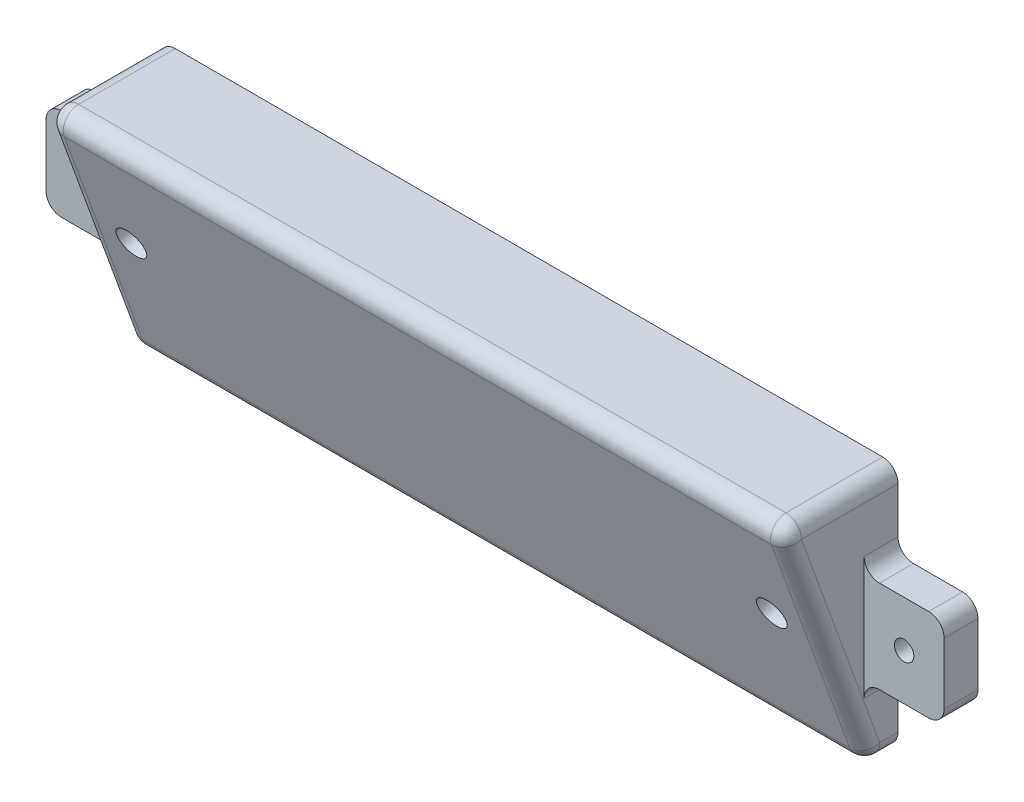
ISO-10303-21;
HEADER;
FILE_DESCRIPTION(('STEP AP214'),'2;1');
FILE_NAME('part.step','',(''),(''),'','','');
FILE_SCHEMA(('AUTOMOTIVE_DESIGN { 1 0 10303 214 1 1 1 1 }'));
ENDSEC;
DATA;
#1=APPLICATION_CONTEXT('core data for automotive mechanical design processes');
#2=APPLICATION_PROTOCOL_DEFINITION('international standard','automotive_design',2000,#1);
#3=PRODUCT_CONTEXT('',#1,'mechanical');
#4=PRODUCT('Part','Part','',(#3));
#5=PRODUCT_RELATED_PRODUCT_CATEGORY('part','',(#4));
#6=PRODUCT_DEFINITION_FORMATION('','',#4);
#7=PRODUCT_DEFINITION_CONTEXT('part definition',#1,'design');
#8=PRODUCT_DEFINITION('design','',#6,#7);
#9=PRODUCT_DEFINITION_SHAPE('','',#8);
#10=(LENGTH_UNIT() NAMED_UNIT(*) SI_UNIT(.MILLI.,.METRE.));
#11=(NAMED_UNIT(*) PLANE_ANGLE_UNIT() SI_UNIT($,.RADIAN.));
#12=(NAMED_UNIT(*) SI_UNIT($,.STERADIAN.) SOLID_ANGLE_UNIT());
#13=UNCERTAINTY_MEASURE_WITH_UNIT(LENGTH_MEASURE(1.E-05),#10,'distance_accuracy_value','');
#14=(GEOMETRIC_REPRESENTATION_CONTEXT(3) GLOBAL_UNCERTAINTY_ASSIGNED_CONTEXT((#13)) GLOBAL_UNIT_ASSIGNED_CONTEXT((#10,
#11,#12)) REPRESENTATION_CONTEXT('',''));
#15=CARTESIAN_POINT('',(0.,0.,0.));
#16=DIRECTION('',(0.,0.,1.));
#17=DIRECTION('',(1.,0.,0.));
#18=AXIS2_PLACEMENT_3D('',#15,#16,#17);
#19=CARTESIAN_POINT('',(-76.2,0.,6.));
#20=DIRECTION('',(1.,0.,0.));
#21=DIRECTION('',(0.,0.,-1.));
#22=AXIS2_PLACEMENT_3D('',#19,#20,#21);
#23=PLANE('',#22);
#24=DIRECTION('',(0.,-1.,0.));
#25=VECTOR('',#24,1.);
#26=CARTESIAN_POINT('',(-76.2,0.,0.));
#27=LINE('',#26,#25);
#28=CARTESIAN_POINT('',(-76.2,-12.7,0.));
#29=VERTEX_POINT('',#28);
#30=CARTESIAN_POINT('',(-76.2,-22.225,0.));
#31=VERTEX_POINT('',#30);
#32=EDGE_CURVE('E487',#29,#31,#27,.T.);
#33=ORIENTED_EDGE('',*,*,#32,.T.);
#34=DIRECTION('',(0.,0.,-1.));
#35=VECTOR('',#34,1.);
#36=CARTESIAN_POINT('',(-76.2,-22.225,6.));
#37=LINE('',#36,#35);
#38=CARTESIAN_POINT('',(-76.2,-22.225,3.77684106618417));
#39=VERTEX_POINT('',#38);
#40=EDGE_CURVE('E346',#31,#39,#37,.F.);
#41=ORIENTED_EDGE('',*,*,#40,.T.);
#42=DIRECTION('',(0.,0.939692620785908,0.342020143325669));
#43=VECTOR('',#42,1.);
#44=CARTESIAN_POINT('',(-76.2,26.485913955059,21.5061638297279));
#45=LINE('',#44,#43);
#46=CARTESIAN_POINT('',(-76.2,22.225,19.9553179793169));
#47=VERTEX_POINT('',#46);
#48=EDGE_CURVE('E240',#39,#47,#45,.T.);
#49=ORIENTED_EDGE('',*,*,#48,.T.);
#50=DIRECTION('',(0.,0.,-1.));
#51=VECTOR('',#50,1.);
#52=CARTESIAN_POINT('',(-76.2,22.225,0.));
#53=LINE('',#52,#51);
#54=CARTESIAN_POINT('',(-76.2,22.225,0.));
#55=VERTEX_POINT('',#54);
#56=EDGE_CURVE('E341',#47,#55,#53,.T.);
#57=ORIENTED_EDGE('',*,*,#56,.T.);
#58=CARTESIAN_POINT('',(-76.2,12.7,0.));
#59=VERTEX_POINT('',#58);
#60=EDGE_CURVE('E264',#55,#59,#27,.T.);
#61=ORIENTED_EDGE('',*,*,#60,.T.);
#62=DIRECTION('',(0.,0.,-1.));
#63=VECTOR('',#62,1.);
#64=CARTESIAN_POINT('',(-76.2,12.7,6.));
#65=LINE('',#64,#63);
#66=CARTESIAN_POINT('',(-76.2,12.7,7.));
#67=VERTEX_POINT('',#66);
#68=EDGE_CURVE('E333',#59,#67,#65,.F.);
#69=ORIENTED_EDGE('',*,*,#68,.T.);
#70=DIRECTION('',(0.,1.,0.));
#71=VECTOR('',#70,1.);
#72=CARTESIAN_POINT('',(-76.2,0.,7.));
#73=LINE('',#72,#71);
#74=CARTESIAN_POINT('',(-76.2,-12.7,7.));
#75=VERTEX_POINT('',#74);
#76=EDGE_CURVE('E690',#75,#67,#73,.T.);
#77=ORIENTED_EDGE('',*,*,#76,.F.);
#78=DIRECTION('',(0.,0.,-1.));
#79=VECTOR('',#78,1.);
#80=CARTESIAN_POINT('',(-76.2,-12.7,6.));
#81=LINE('',#80,#79);
#82=EDGE_CURVE('E337',#75,#29,#81,.T.);
#83=ORIENTED_EDGE('',*,*,#82,.T.);
#84=EDGE_LOOP('',(#33,#41,#49,#57,#61,#69,#77,#83));
#85=FACE_BOUND('',#84,.T.);
#86=ADVANCED_FACE('F45',(#85),#23,.F.);
#87=CARTESIAN_POINT('',(76.2,0.,6.));
#88=DIRECTION('',(1.,0.,0.));
#89=DIRECTION('',(0.,0.,-1.));
#90=AXIS2_PLACEMENT_3D('',#87,#88,#89);
#91=PLANE('',#90);
#92=DIRECTION('',(0.,0.939692620785908,0.342020143325669));
#93=VECTOR('',#92,1.);
#94=CARTESIAN_POINT('',(76.2,-1.88532161732999,11.1798785720238));
#95=LINE('',#94,#93);
#96=CARTESIAN_POINT('',(76.2,22.225,19.9553179793169));
#97=VERTEX_POINT('',#96);
#98=CARTESIAN_POINT('',(76.2,-22.225,3.77684106618417));
#99=VERTEX_POINT('',#98);
#100=EDGE_CURVE('E284',#97,#99,#95,.F.);
#101=ORIENTED_EDGE('',*,*,#100,.T.);
#102=DIRECTION('',(0.,0.,-1.));
#103=VECTOR('',#102,1.);
#104=CARTESIAN_POINT('',(76.2,-22.225,0.));
#105=LINE('',#104,#103);
#106=CARTESIAN_POINT('',(76.2,-22.225,0.));
#107=VERTEX_POINT('',#106);
#108=EDGE_CURVE('E288',#99,#107,#105,.T.);
#109=ORIENTED_EDGE('',*,*,#108,.T.);
#110=DIRECTION('',(0.,-1.,0.));
#111=VECTOR('',#110,1.);
#112=CARTESIAN_POINT('',(76.2,0.,0.));
#113=LINE('',#112,#111);
#114=CARTESIAN_POINT('',(76.2,-12.7,0.));
#115=VERTEX_POINT('',#114);
#116=EDGE_CURVE('E483',#115,#107,#113,.T.);
#117=ORIENTED_EDGE('',*,*,#116,.F.);
#118=DIRECTION('',(0.,0.,-1.));
#119=VECTOR('',#118,1.);
#120=CARTESIAN_POINT('',(76.2,-12.7,6.));
#121=LINE('',#120,#119);
#122=CARTESIAN_POINT('',(76.2,-12.7,7.));
#123=VERTEX_POINT('',#122);
#124=EDGE_CURVE('E273',#115,#123,#121,.F.);
#125=ORIENTED_EDGE('',*,*,#124,.T.);
#126=DIRECTION('',(0.,-1.,0.));
#127=VECTOR('',#126,1.);
#128=CARTESIAN_POINT('',(76.2,0.,7.));
#129=LINE('',#128,#127);
#130=CARTESIAN_POINT('',(76.2,12.7,7.));
#131=VERTEX_POINT('',#130);
#132=EDGE_CURVE('E539',#131,#123,#129,.T.);
#133=ORIENTED_EDGE('',*,*,#132,.F.);
#134=DIRECTION('',(0.,0.,-1.));
#135=VECTOR('',#134,1.);
#136=CARTESIAN_POINT('',(76.2,12.7,0.));
#137=LINE('',#136,#135);
#138=CARTESIAN_POINT('',(76.2,12.7,0.));
#139=VERTEX_POINT('',#138);
#140=EDGE_CURVE('E277',#131,#139,#137,.T.);
#141=ORIENTED_EDGE('',*,*,#140,.T.);
#142=CARTESIAN_POINT('',(76.2,22.225,0.));
#143=VERTEX_POINT('',#142);
#144=EDGE_CURVE('E477',#143,#139,#113,.T.);
#145=ORIENTED_EDGE('',*,*,#144,.F.);
#146=DIRECTION('',(0.,0.,-1.));
#147=VECTOR('',#146,1.);
#148=CARTESIAN_POINT('',(76.2,22.225,6.));
#149=LINE('',#148,#147);
#150=EDGE_CURVE('E281',#143,#97,#149,.F.);
#151=ORIENTED_EDGE('',*,*,#150,.T.);
#152=EDGE_LOOP('',(#101,#109,#117,#125,#133,#141,#145,#151));
#153=FACE_BOUND('',#152,.T.);
#154=ADVANCED_FACE('F480',(#153),#91,.T.);
#155=CARTESIAN_POINT('',(0.,25.4,6.));
#156=DIRECTION('',(0.,1.,0.));
#157=DIRECTION('',(0.,0.,1.));
#158=AXIS2_PLACEMENT_3D('',#155,#156,#157);
#159=PLANE('',#158);
#160=DIRECTION('',(-1.,0.,0.));
#161=VECTOR('',#160,1.);
#162=CARTESIAN_POINT('',(0.,25.4,19.9553179793169));
#163=LINE('',#162,#161);
#164=CARTESIAN_POINT('',(-73.025,25.4,19.9553179793169));
#165=VERTEX_POINT('',#164);
#166=CARTESIAN_POINT('',(73.025,25.4,19.9553179793169));
#167=VERTEX_POINT('',#166);
#168=EDGE_CURVE('E327',#165,#167,#163,.F.);
#169=ORIENTED_EDGE('',*,*,#168,.T.);
#170=DIRECTION('',(0.,0.,-1.));
#171=VECTOR('',#170,1.);
#172=CARTESIAN_POINT('',(73.025,25.4,6.));
#173=LINE('',#172,#171);
#174=CARTESIAN_POINT('',(73.025,25.4,0.));
#175=VERTEX_POINT('',#174);
#176=EDGE_CURVE('E330',#167,#175,#173,.T.);
#177=ORIENTED_EDGE('',*,*,#176,.T.);
#178=DIRECTION('',(1.,0.,0.));
#179=VECTOR('',#178,1.);
#180=CARTESIAN_POINT('',(0.,25.4,0.));
#181=LINE('',#180,#179);
#182=CARTESIAN_POINT('',(-73.025,25.4,0.));
#183=VERTEX_POINT('',#182);
#184=EDGE_CURVE('E478',#183,#175,#181,.T.);
#185=ORIENTED_EDGE('',*,*,#184,.F.);
#186=DIRECTION('',(0.,0.,-1.));
#187=VECTOR('',#186,1.);
#188=CARTESIAN_POINT('',(-73.025,25.4,24.4896879007231));
#189=LINE('',#188,#187);
#190=EDGE_CURVE('E324',#183,#165,#189,.F.);
#191=ORIENTED_EDGE('',*,*,#190,.T.);
#192=EDGE_LOOP('',(#169,#177,#185,#191));
#193=FACE_BOUND('',#192,.T.);
#194=ADVANCED_FACE('F461',(#193),#159,.T.);
#195=CARTESIAN_POINT('',(0.,-25.4,6.));
#196=DIRECTION('',(0.,1.,0.));
#197=DIRECTION('',(0.,0.,1.));
#198=AXIS2_PLACEMENT_3D('',#195,#196,#197);
#199=PLANE('',#198);
#200=DIRECTION('',(1.,0.,0.));
#201=VECTOR('',#200,1.);
#202=CARTESIAN_POINT('',(0.,-25.4,0.));
#203=LINE('',#202,#201);
#204=CARTESIAN_POINT('',(-73.025,-25.4,0.));
#205=VERTEX_POINT('',#204);
#206=CARTESIAN_POINT('',(73.025,-25.4,0.));
#207=VERTEX_POINT('',#206);
#208=EDGE_CURVE('E260',#205,#207,#203,.T.);
#209=ORIENTED_EDGE('',*,*,#208,.T.);
#210=DIRECTION('',(0.,0.,-1.));
#211=VECTOR('',#210,1.);
#212=CARTESIAN_POINT('',(73.025,-25.4,6.));
#213=LINE('',#212,#211);
#214=CARTESIAN_POINT('',(73.025,-25.4,3.77684106618417));
#215=VERTEX_POINT('',#214);
#216=EDGE_CURVE('E321',#207,#215,#213,.F.);
#217=ORIENTED_EDGE('',*,*,#216,.T.);
#218=DIRECTION('',(1.,0.,0.));
#219=VECTOR('',#218,1.);
#220=CARTESIAN_POINT('',(-76.2,-25.4,3.77684106618417));
#221=LINE('',#220,#219);
#222=CARTESIAN_POINT('',(-73.025,-25.4,3.77684106618417));
#223=VERTEX_POINT('',#222);
#224=EDGE_CURVE('E318',#215,#223,#221,.F.);
#225=ORIENTED_EDGE('',*,*,#224,.T.);
#226=DIRECTION('',(0.,0.,-1.));
#227=VECTOR('',#226,1.);
#228=CARTESIAN_POINT('',(-73.025,-25.4,6.));
#229=LINE('',#228,#227);
#230=EDGE_CURVE('E315',#223,#205,#229,.T.);
#231=ORIENTED_EDGE('',*,*,#230,.T.);
#232=EDGE_LOOP('',(#209,#217,#225,#231));
#233=FACE_BOUND('',#232,.T.);
#234=ADVANCED_FACE('F600',(#233),#199,.F.);
#235=CARTESIAN_POINT('',(0.,0.,0.));
#236=DIRECTION('',(0.,0.,1.));
#237=DIRECTION('',(1.,0.,0.));
#238=AXIS2_PLACEMENT_3D('',#235,#236,#237);
#239=PLANE('',#238);
#240=ORIENTED_EDGE('',*,*,#116,.T.);
#241=CARTESIAN_POINT('',(73.025,-22.225,0.));
#242=DIRECTION('',(0.,0.,1.));
#243=DIRECTION('',(1.,0.,0.));
#244=AXIS2_PLACEMENT_3D('',#241,#242,#243);
#245=CIRCLE('',#244,3.175);
#246=EDGE_CURVE('E312',#107,#207,#245,.F.);
#247=ORIENTED_EDGE('',*,*,#246,.T.);
#248=ORIENTED_EDGE('',*,*,#208,.F.);
#249=CARTESIAN_POINT('',(-73.025,-22.225,0.));
#250=DIRECTION('',(0.,0.,1.));
#251=DIRECTION('',(1.,0.,0.));
#252=AXIS2_PLACEMENT_3D('',#249,#250,#251);
#253=CIRCLE('',#252,3.175);
#254=EDGE_CURVE('E306',#205,#31,#253,.F.);
#255=ORIENTED_EDGE('',*,*,#254,.T.);
#256=ORIENTED_EDGE('',*,*,#32,.F.);
#257=CARTESIAN_POINT('',(-79.375,-12.7,0.));
#258=DIRECTION('',(0.,0.,1.));
#259=DIRECTION('',(1.,0.,0.));
#260=AXIS2_PLACEMENT_3D('',#257,#258,#259);
#261=CIRCLE('',#260,3.175);
#262=CARTESIAN_POINT('',(-79.375,-9.525,0.));
#263=VERTEX_POINT('',#262);
#264=EDGE_CURVE('E414',#29,#263,#261,.T.);
#265=ORIENTED_EDGE('',*,*,#264,.T.);
#266=DIRECTION('',(-1.,0.,0.));
#267=VECTOR('',#266,1.);
#268=CARTESIAN_POINT('',(0.,-9.52500000000003,0.));
#269=LINE('',#268,#267);
#270=CARTESIAN_POINT('',(-89.535,-9.525,0.));
#271=VERTEX_POINT('',#270);
#272=EDGE_CURVE('E511',#263,#271,#269,.T.);
#273=ORIENTED_EDGE('',*,*,#272,.T.);
#274=CARTESIAN_POINT('',(-89.535,-6.35,0.));
#275=DIRECTION('',(0.,0.,1.));
#276=DIRECTION('',(1.,0.,0.));
#277=AXIS2_PLACEMENT_3D('',#274,#275,#276);
#278=CIRCLE('',#277,3.175);
#279=CARTESIAN_POINT('',(-92.71,-6.35,0.));
#280=VERTEX_POINT('',#279);
#281=EDGE_CURVE('E291',#271,#280,#278,.F.);
#282=ORIENTED_EDGE('',*,*,#281,.T.);
#283=DIRECTION('',(0.,1.,0.));
#284=VECTOR('',#283,1.);
#285=CARTESIAN_POINT('',(-92.71,0.,0.));
#286=LINE('',#285,#284);
#287=CARTESIAN_POINT('',(-92.71,6.35,0.));
#288=VERTEX_POINT('',#287);
#289=EDGE_CURVE('E517',#280,#288,#286,.T.);
#290=ORIENTED_EDGE('',*,*,#289,.T.);
#291=CARTESIAN_POINT('',(-89.535,6.35,0.));
#292=DIRECTION('',(0.,0.,1.));
#293=DIRECTION('',(1.,0.,0.));
#294=AXIS2_PLACEMENT_3D('',#291,#292,#293);
#295=CIRCLE('',#294,3.175);
#296=CARTESIAN_POINT('',(-89.535,9.525,0.));
#297=VERTEX_POINT('',#296);
#298=EDGE_CURVE('E294',#288,#297,#295,.F.);
#299=ORIENTED_EDGE('',*,*,#298,.T.);
#300=DIRECTION('',(1.,0.,0.));
#301=VECTOR('',#300,1.);
#302=CARTESIAN_POINT('',(0.,9.52500000000001,0.));
#303=LINE('',#302,#301);
#304=CARTESIAN_POINT('',(-79.375,9.525,0.));
#305=VERTEX_POINT('',#304);
#306=EDGE_CURVE('E526',#297,#305,#303,.T.);
#307=ORIENTED_EDGE('',*,*,#306,.T.);
#308=CARTESIAN_POINT('',(-79.375,12.7,0.));
#309=DIRECTION('',(0.,0.,1.));
#310=DIRECTION('',(1.,0.,0.));
#311=AXIS2_PLACEMENT_3D('',#308,#309,#310);
#312=CIRCLE('',#311,3.175);
#313=EDGE_CURVE('E55',#305,#59,#312,.T.);
#314=ORIENTED_EDGE('',*,*,#313,.T.);
#315=ORIENTED_EDGE('',*,*,#60,.F.);
#316=CARTESIAN_POINT('',(-73.025,22.225,0.));
#317=DIRECTION('',(0.,0.,1.));
#318=DIRECTION('',(1.,0.,0.));
#319=AXIS2_PLACEMENT_3D('',#316,#317,#318);
#320=CIRCLE('',#319,3.175);
#321=EDGE_CURVE('E303',#55,#183,#320,.F.);
#322=ORIENTED_EDGE('',*,*,#321,.T.);
#323=ORIENTED_EDGE('',*,*,#184,.T.);
#324=CARTESIAN_POINT('',(73.025,22.225,0.));
#325=DIRECTION('',(0.,0.,1.));
#326=DIRECTION('',(1.,0.,0.));
#327=AXIS2_PLACEMENT_3D('',#324,#325,#326);
#328=CIRCLE('',#327,3.175);
#329=EDGE_CURVE('E309',#175,#143,#328,.F.);
#330=ORIENTED_EDGE('',*,*,#329,.T.);
#331=ORIENTED_EDGE('',*,*,#144,.T.);
#332=CARTESIAN_POINT('',(79.375,12.7,0.));
#333=DIRECTION('',(0.,0.,1.));
#334=DIRECTION('',(1.,0.,0.));
#335=AXIS2_PLACEMENT_3D('',#332,#333,#334);
#336=CIRCLE('',#335,3.175);
#337=CARTESIAN_POINT('',(79.375,9.525,0.));
#338=VERTEX_POINT('',#337);
#339=EDGE_CURVE('E401',#139,#338,#336,.T.);
#340=ORIENTED_EDGE('',*,*,#339,.T.);
#341=DIRECTION('',(1.,0.,0.));
#342=VECTOR('',#341,1.);
#343=CARTESIAN_POINT('',(0.,9.52500000000003,0.));
#344=LINE('',#343,#342);
#345=CARTESIAN_POINT('',(89.535,9.525,0.));
#346=VERTEX_POINT('',#345);
#347=EDGE_CURVE('E556',#338,#346,#344,.T.);
#348=ORIENTED_EDGE('',*,*,#347,.T.);
#349=CARTESIAN_POINT('',(89.535,6.35,0.));
#350=DIRECTION('',(0.,0.,1.));
#351=DIRECTION('',(1.,0.,0.));
#352=AXIS2_PLACEMENT_3D('',#349,#350,#351);
#353=CIRCLE('',#352,3.175);
#354=CARTESIAN_POINT('',(92.71,6.35,0.));
#355=VERTEX_POINT('',#354);
#356=EDGE_CURVE('E300',#346,#355,#353,.F.);
#357=ORIENTED_EDGE('',*,*,#356,.T.);
#358=DIRECTION('',(0.,-1.,0.));
#359=VECTOR('',#358,1.);
#360=CARTESIAN_POINT('',(92.71,0.,0.));
#361=LINE('',#360,#359);
#362=CARTESIAN_POINT('',(92.71,-6.35,0.));
#363=VERTEX_POINT('',#362);
#364=EDGE_CURVE('E491',#355,#363,#361,.T.);
#365=ORIENTED_EDGE('',*,*,#364,.T.);
#366=CARTESIAN_POINT('',(89.535,-6.35,0.));
#367=DIRECTION('',(0.,0.,1.));
#368=DIRECTION('',(1.,0.,0.));
#369=AXIS2_PLACEMENT_3D('',#366,#367,#368);
#370=CIRCLE('',#369,3.175);
#371=CARTESIAN_POINT('',(89.535,-9.525,0.));
#372=VERTEX_POINT('',#371);
#373=EDGE_CURVE('E297',#363,#372,#370,.F.);
#374=ORIENTED_EDGE('',*,*,#373,.T.);
#375=DIRECTION('',(1.,0.,0.));
#376=VECTOR('',#375,1.);
#377=CARTESIAN_POINT('',(0.,-9.52500000000003,0.));
#378=LINE('',#377,#376);
#379=CARTESIAN_POINT('',(79.375,-9.525,0.));
#380=VERTEX_POINT('',#379);
#381=EDGE_CURVE('E553',#380,#372,#378,.T.);
#382=ORIENTED_EDGE('',*,*,#381,.F.);
#383=CARTESIAN_POINT('',(79.375,-12.7,0.));
#384=DIRECTION('',(0.,0.,1.));
#385=DIRECTION('',(1.,0.,0.));
#386=AXIS2_PLACEMENT_3D('',#383,#384,#385);
#387=CIRCLE('',#386,3.175);
#388=EDGE_CURVE('E408',#380,#115,#387,.T.);
#389=ORIENTED_EDGE('',*,*,#388,.T.);
#390=EDGE_LOOP('',(#240,#247,#248,#255,#256,#265,#273,#282,#290,#299,#307,#314,#315,#322,#323,
#330,#331,#340,#348,#357,#365,#374,#382,#389));
#391=FACE_BOUND('',#390,.T.);
#392=CARTESIAN_POINT('',(84.455,0.,0.));
#393=DIRECTION('',(0.,0.,-1.));
#394=DIRECTION('',(-1.,0.,0.));
#395=AXIS2_PLACEMENT_3D('',#392,#393,#394);
#396=CIRCLE('',#395,2.);
#397=CARTESIAN_POINT('',(82.455,0.,0.));
#398=VERTEX_POINT('',#397);
#399=EDGE_CURVE('E549',#398,#398,#396,.T.);
#400=ORIENTED_EDGE('',*,*,#399,.F.);
#401=EDGE_LOOP('',(#400));
#402=FACE_BOUND('',#401,.T.);
#403=CARTESIAN_POINT('',(-84.455,0.,0.));
#404=DIRECTION('',(0.,0.,-1.));
#405=DIRECTION('',(-1.,0.,0.));
#406=AXIS2_PLACEMENT_3D('',#403,#404,#405);
#407=CIRCLE('',#406,2.);
#408=CARTESIAN_POINT('',(-86.455,0.,0.));
#409=VERTEX_POINT('',#408);
#410=EDGE_CURVE('E508',#409,#409,#407,.T.);
#411=ORIENTED_EDGE('',*,*,#410,.F.);
#412=EDGE_LOOP('',(#411));
#413=FACE_BOUND('',#412,.T.);
#414=ADVANCED_FACE('F475',(#391,#402,#413),#239,.F.);
#415=CARTESIAN_POINT('',(130.260230841776,25.4,24.4896879007231));
#416=DIRECTION('',(0.,-0.342020143325669,0.939692620785908));
#417=DIRECTION('',(0.,-0.939692620785908,-0.342020143325669));
#418=AXIS2_PLACEMENT_3D('',#415,#416,#417);
#419=PLANE('',#418);
#420=CARTESIAN_POINT('',(-66.11875,2.01260506080119,15.9773722858267));
#421=DIRECTION('',(0.,-0.342020143325669,0.939692620785908));
#422=DIRECTION('',(0.,-0.939692620785908,-0.342020143325669));
#423=AXIS2_PLACEMENT_3D('',#420,#421,#422);
#424=CIRCLE('',#423,3.02500000000001);
#425=CARTESIAN_POINT('',(-66.11875,-0.829965117076185,14.9427613522666));
#426=VERTEX_POINT('',#425);
#427=EDGE_CURVE('E707',#426,#426,#424,.T.);
#428=ORIENTED_EDGE('',*,*,#427,.F.);
#429=EDGE_LOOP('',(#428));
#430=FACE_BOUND('',#429,.T.);
#431=CARTESIAN_POINT('',(66.11875,2.01260506080124,15.9773722858267));
#432=DIRECTION('',(0.,-0.342020143325669,0.939692620785908));
#433=DIRECTION('',(0.,-0.939692620785908,-0.342020143325669));
#434=AXIS2_PLACEMENT_3D('',#431,#432,#433);
#435=CIRCLE('',#434,3.02500000000001);
#436=CARTESIAN_POINT('',(66.11875,-0.829965117076136,14.9427613522666));
#437=VERTEX_POINT('',#436);
#438=EDGE_CURVE('E703',#437,#437,#435,.T.);
#439=ORIENTED_EDGE('',*,*,#438,.F.);
#440=EDGE_LOOP('',(#439));
#441=FACE_BOUND('',#440,.T.);
#442=DIRECTION('',(1.,0.,0.));
#443=VECTOR('',#442,1.);
#444=CARTESIAN_POINT('',(76.2,-23.310913955059,6.76036513717943));
#445=LINE('',#444,#443);
#446=CARTESIAN_POINT('',(-73.025,-23.310913955059,6.76036513717943));
#447=VERTEX_POINT('',#446);
#448=CARTESIAN_POINT('',(73.025,-23.310913955059,6.76036513717943));
#449=VERTEX_POINT('',#448);
#450=EDGE_CURVE('E226',#447,#449,#445,.T.);
#451=ORIENTED_EDGE('',*,*,#450,.T.);
#452=DIRECTION('',(0.,0.939692620785908,0.342020143325669));
#453=VECTOR('',#452,1.);
#454=CARTESIAN_POINT('',(73.025,25.4,24.4896879007231));
#455=LINE('',#454,#453);
#456=CARTESIAN_POINT('',(73.025,21.139086044941,22.9388420503122));
#457=VERTEX_POINT('',#456);
#458=EDGE_CURVE('E270',#449,#457,#455,.T.);
#459=ORIENTED_EDGE('',*,*,#458,.T.);
#460=DIRECTION('',(-1.,0.,0.));
#461=VECTOR('',#460,1.);
#462=CARTESIAN_POINT('',(130.260230841776,21.139086044941,22.9388420503122));
#463=LINE('',#462,#461);
#464=CARTESIAN_POINT('',(-73.025,21.139086044941,22.9388420503122));
#465=VERTEX_POINT('',#464);
#466=EDGE_CURVE('E229',#457,#465,#463,.T.);
#467=ORIENTED_EDGE('',*,*,#466,.T.);
#468=DIRECTION('',(0.,0.939692620785908,0.342020143325669));
#469=VECTOR('',#468,1.);
#470=CARTESIAN_POINT('',(-73.025,-25.4,5.99999999999999));
#471=LINE('',#470,#469);
#472=EDGE_CURVE('E221',#465,#447,#471,.F.);
#473=ORIENTED_EDGE('',*,*,#472,.T.);
#474=EDGE_LOOP('',(#451,#459,#467,#473));
#475=FACE_BOUND('',#474,.T.);
#476=ADVANCED_FACE('F223',(#430,#441,#475),#419,.T.);
#477=CARTESIAN_POINT('',(0.,-9.52500000000003,7.));
#478=DIRECTION('',(0.,1.,0.));
#479=DIRECTION('',(-1.,0.,0.));
#480=AXIS2_PLACEMENT_3D('',#477,#478,#479);
#481=PLANE('',#480);
#482=ORIENTED_EDGE('',*,*,#381,.T.);
#483=DIRECTION('',(0.,0.,-1.));
#484=VECTOR('',#483,1.);
#485=CARTESIAN_POINT('',(89.535,-9.525,7.));
#486=LINE('',#485,#484);
#487=CARTESIAN_POINT('',(89.535,-9.525,7.));
#488=VERTEX_POINT('',#487);
#489=EDGE_CURVE('E373',#372,#488,#486,.F.);
#490=ORIENTED_EDGE('',*,*,#489,.T.);
#491=DIRECTION('',(1.,0.,0.));
#492=VECTOR('',#491,1.);
#493=CARTESIAN_POINT('',(0.,-9.52500000000003,7.));
#494=LINE('',#493,#492);
#495=CARTESIAN_POINT('',(79.375,-9.525,7.));
#496=VERTEX_POINT('',#495);
#497=EDGE_CURVE('E535',#496,#488,#494,.T.);
#498=ORIENTED_EDGE('',*,*,#497,.F.);
#499=DIRECTION('',(0.,0.,-1.));
#500=VECTOR('',#499,1.);
#501=CARTESIAN_POINT('',(79.375,-9.525,7.));
#502=LINE('',#501,#500);
#503=EDGE_CURVE('E369',#496,#380,#502,.T.);
#504=ORIENTED_EDGE('',*,*,#503,.T.);
#505=EDGE_LOOP('',(#482,#490,#498,#504));
#506=FACE_BOUND('',#505,.T.);
#507=ADVANCED_FACE('F590',(#506),#481,.F.);
#508=CARTESIAN_POINT('',(92.71,0.,7.));
#509=DIRECTION('',(1.,0.,0.));
#510=DIRECTION('',(0.,0.,-1.));
#511=AXIS2_PLACEMENT_3D('',#508,#509,#510);
#512=PLANE('',#511);
#513=ORIENTED_EDGE('',*,*,#364,.F.);
#514=DIRECTION('',(0.,0.,-1.));
#515=VECTOR('',#514,1.);
#516=CARTESIAN_POINT('',(92.71,6.35,7.));
#517=LINE('',#516,#515);
#518=CARTESIAN_POINT('',(92.71,6.35,7.));
#519=VERTEX_POINT('',#518);
#520=EDGE_CURVE('E360',#355,#519,#517,.F.);
#521=ORIENTED_EDGE('',*,*,#520,.T.);
#522=DIRECTION('',(0.,-1.,0.));
#523=VECTOR('',#522,1.);
#524=CARTESIAN_POINT('',(92.71,0.,7.));
#525=LINE('',#524,#523);
#526=CARTESIAN_POINT('',(92.71,-6.35,7.));
#527=VERTEX_POINT('',#526);
#528=EDGE_CURVE('E489',#519,#527,#525,.T.);
#529=ORIENTED_EDGE('',*,*,#528,.T.);
#530=DIRECTION('',(0.,0.,-1.));
#531=VECTOR('',#530,1.);
#532=CARTESIAN_POINT('',(92.71,-6.35,0.));
#533=LINE('',#532,#531);
#534=EDGE_CURVE('E356',#527,#363,#533,.T.);
#535=ORIENTED_EDGE('',*,*,#534,.T.);
#536=EDGE_LOOP('',(#513,#521,#529,#535));
#537=FACE_BOUND('',#536,.T.);
#538=ADVANCED_FACE('F566',(#537),#512,.T.);
#539=CARTESIAN_POINT('',(0.,9.52500000000003,7.));
#540=DIRECTION('',(0.,1.,0.));
#541=DIRECTION('',(-1.,0.,0.));
#542=AXIS2_PLACEMENT_3D('',#539,#540,#541);
#543=PLANE('',#542);
#544=ORIENTED_EDGE('',*,*,#347,.F.);
#545=DIRECTION('',(0.,0.,-1.));
#546=VECTOR('',#545,1.);
#547=CARTESIAN_POINT('',(79.375,9.525,7.));
#548=LINE('',#547,#546);
#549=CARTESIAN_POINT('',(79.375,9.525,7.));
#550=VERTEX_POINT('',#549);
#551=EDGE_CURVE('E353',#338,#550,#548,.F.);
#552=ORIENTED_EDGE('',*,*,#551,.T.);
#553=DIRECTION('',(1.,0.,0.));
#554=VECTOR('',#553,1.);
#555=CARTESIAN_POINT('',(0.,9.52500000000003,7.));
#556=LINE('',#555,#554);
#557=CARTESIAN_POINT('',(89.535,9.525,7.));
#558=VERTEX_POINT('',#557);
#559=EDGE_CURVE('E542',#550,#558,#556,.T.);
#560=ORIENTED_EDGE('',*,*,#559,.T.);
#561=DIRECTION('',(0.,0.,-1.));
#562=VECTOR('',#561,1.);
#563=CARTESIAN_POINT('',(89.535,9.525,7.));
#564=LINE('',#563,#562);
#565=EDGE_CURVE('E349',#558,#346,#564,.T.);
#566=ORIENTED_EDGE('',*,*,#565,.T.);
#567=EDGE_LOOP('',(#544,#552,#560,#566));
#568=FACE_BOUND('',#567,.T.);
#569=ADVANCED_FACE('F578',(#568),#543,.T.);
#570=CARTESIAN_POINT('',(84.455,0.,7.));
#571=DIRECTION('',(0.,0.,-1.));
#572=DIRECTION('',(-1.,0.,0.));
#573=AXIS2_PLACEMENT_3D('',#570,#571,#572);
#574=CYLINDRICAL_SURFACE('',#573,2.);
#575=CARTESIAN_POINT('',(84.455,0.,7.));
#576=DIRECTION('',(0.,0.,-1.));
#577=DIRECTION('',(-1.,0.,0.));
#578=AXIS2_PLACEMENT_3D('',#575,#576,#577);
#579=CIRCLE('',#578,2.);
#580=CARTESIAN_POINT('',(82.455,0.,7.));
#581=VERTEX_POINT('',#580);
#582=EDGE_CURVE('E531',#581,#581,#579,.T.);
#583=ORIENTED_EDGE('',*,*,#582,.F.);
#584=EDGE_LOOP('',(#583));
#585=FACE_BOUND('',#584,.T.);
#586=ORIENTED_EDGE('',*,*,#399,.T.);
#587=EDGE_LOOP('',(#586));
#588=FACE_BOUND('',#587,.T.);
#589=ADVANCED_FACE('F757',(#585,#588),#574,.F.);
#590=CARTESIAN_POINT('',(0.,0.,7.));
#591=DIRECTION('',(0.,0.,-1.));
#592=DIRECTION('',(-1.,0.,0.));
#593=AXIS2_PLACEMENT_3D('',#590,#591,#592);
#594=PLANE('',#593);
#595=ORIENTED_EDGE('',*,*,#582,.T.);
#596=EDGE_LOOP('',(#595));
#597=FACE_BOUND('',#596,.T.);
#598=ORIENTED_EDGE('',*,*,#528,.F.);
#599=CARTESIAN_POINT('',(89.535,6.35,7.));
#600=DIRECTION('',(0.,0.,-1.));
#601=DIRECTION('',(-1.,0.,0.));
#602=AXIS2_PLACEMENT_3D('',#599,#600,#601);
#603=CIRCLE('',#602,3.175);
#604=EDGE_CURVE('E366',#519,#558,#603,.F.);
#605=ORIENTED_EDGE('',*,*,#604,.T.);
#606=ORIENTED_EDGE('',*,*,#559,.F.);
#607=CARTESIAN_POINT('',(79.375,12.7,7.));
#608=DIRECTION('',(0.,0.,-1.));
#609=DIRECTION('',(-1.,0.,0.));
#610=AXIS2_PLACEMENT_3D('',#607,#608,#609);
#611=CIRCLE('',#610,3.175);
#612=EDGE_CURVE('E404',#550,#131,#611,.T.);
#613=ORIENTED_EDGE('',*,*,#612,.T.);
#614=ORIENTED_EDGE('',*,*,#132,.T.);
#615=CARTESIAN_POINT('',(79.375,-12.7,7.));
#616=DIRECTION('',(0.,0.,-1.));
#617=DIRECTION('',(-1.,0.,0.));
#618=AXIS2_PLACEMENT_3D('',#615,#616,#617);
#619=CIRCLE('',#618,3.175);
#620=EDGE_CURVE('E411',#123,#496,#619,.T.);
#621=ORIENTED_EDGE('',*,*,#620,.T.);
#622=ORIENTED_EDGE('',*,*,#497,.T.);
#623=CARTESIAN_POINT('',(89.535,-6.35,7.));
#624=DIRECTION('',(0.,0.,-1.));
#625=DIRECTION('',(-1.,0.,0.));
#626=AXIS2_PLACEMENT_3D('',#623,#624,#625);
#627=CIRCLE('',#626,3.175);
#628=EDGE_CURVE('E363',#488,#527,#627,.F.);
#629=ORIENTED_EDGE('',*,*,#628,.T.);
#630=EDGE_LOOP('',(#598,#605,#606,#613,#614,#621,#622,#629));
#631=FACE_BOUND('',#630,.T.);
#632=ADVANCED_FACE('F575',(#597,#631),#594,.F.);
#633=CARTESIAN_POINT('',(0.,9.52500000000001,7.));
#634=DIRECTION('',(0.,1.,0.));
#635=DIRECTION('',(-1.,0.,0.));
#636=AXIS2_PLACEMENT_3D('',#633,#634,#635);
#637=PLANE('',#636);
#638=DIRECTION('',(1.,0.,0.));
#639=VECTOR('',#638,1.);
#640=CARTESIAN_POINT('',(0.,9.52500000000001,7.));
#641=LINE('',#640,#639);
#642=CARTESIAN_POINT('',(-89.535,9.525,7.));
#643=VERTEX_POINT('',#642);
#644=CARTESIAN_POINT('',(-79.375,9.525,7.));
#645=VERTEX_POINT('',#644);
#646=EDGE_CURVE('E520',#643,#645,#641,.T.);
#647=ORIENTED_EDGE('',*,*,#646,.T.);
#648=DIRECTION('',(0.,0.,-1.));
#649=VECTOR('',#648,1.);
#650=CARTESIAN_POINT('',(-79.375,9.525,7.));
#651=LINE('',#650,#649);
#652=EDGE_CURVE('E386',#645,#305,#651,.T.);
#653=ORIENTED_EDGE('',*,*,#652,.T.);
#654=ORIENTED_EDGE('',*,*,#306,.F.);
#655=DIRECTION('',(0.,0.,-1.));
#656=VECTOR('',#655,1.);
#657=CARTESIAN_POINT('',(-89.535,9.525,7.));
#658=LINE('',#657,#656);
#659=EDGE_CURVE('E383',#297,#643,#658,.F.);
#660=ORIENTED_EDGE('',*,*,#659,.T.);
#661=EDGE_LOOP('',(#647,#653,#654,#660));
#662=FACE_BOUND('',#661,.T.);
#663=ADVANCED_FACE('F743',(#662),#637,.T.);
#664=CARTESIAN_POINT('',(-92.71,0.,7.));
#665=DIRECTION('',(-1.,0.,0.));
#666=DIRECTION('',(0.,0.,1.));
#667=AXIS2_PLACEMENT_3D('',#664,#665,#666);
#668=PLANE('',#667);
#669=DIRECTION('',(0.,1.,0.));
#670=VECTOR('',#669,1.);
#671=CARTESIAN_POINT('',(-92.71,0.,7.));
#672=LINE('',#671,#670);
#673=CARTESIAN_POINT('',(-92.71,-6.35,7.));
#674=VERTEX_POINT('',#673);
#675=CARTESIAN_POINT('',(-92.71,6.35,7.));
#676=VERTEX_POINT('',#675);
#677=EDGE_CURVE('E677',#674,#676,#672,.T.);
#678=ORIENTED_EDGE('',*,*,#677,.T.);
#679=DIRECTION('',(0.,0.,-1.));
#680=VECTOR('',#679,1.);
#681=CARTESIAN_POINT('',(-92.71,6.35,7.));
#682=LINE('',#681,#680);
#683=EDGE_CURVE('E392',#676,#288,#682,.T.);
#684=ORIENTED_EDGE('',*,*,#683,.T.);
#685=ORIENTED_EDGE('',*,*,#289,.F.);
#686=DIRECTION('',(0.,0.,-1.));
#687=VECTOR('',#686,1.);
#688=CARTESIAN_POINT('',(-92.71,-6.35,7.));
#689=LINE('',#688,#687);
#690=EDGE_CURVE('E70',#280,#674,#689,.F.);
#691=ORIENTED_EDGE('',*,*,#690,.T.);
#692=EDGE_LOOP('',(#678,#684,#685,#691));
#693=FACE_BOUND('',#692,.T.);
#694=ADVANCED_FACE('F676',(#693),#668,.T.);
#695=CARTESIAN_POINT('',(-84.455,0.,7.));
#696=DIRECTION('',(0.,0.,-1.));
#697=DIRECTION('',(-1.,0.,0.));
#698=AXIS2_PLACEMENT_3D('',#695,#696,#697);
#699=CYLINDRICAL_SURFACE('',#698,2.);
#700=CARTESIAN_POINT('',(-84.455,0.,7.));
#701=DIRECTION('',(0.,0.,-1.));
#702=DIRECTION('',(-1.,0.,0.));
#703=AXIS2_PLACEMENT_3D('',#700,#701,#702);
#704=CIRCLE('',#703,2.);
#705=CARTESIAN_POINT('',(-86.455,0.,7.));
#706=VERTEX_POINT('',#705);
#707=EDGE_CURVE('E530',#706,#706,#704,.T.);
#708=ORIENTED_EDGE('',*,*,#707,.F.);
#709=EDGE_LOOP('',(#708));
#710=FACE_BOUND('',#709,.T.);
#711=ORIENTED_EDGE('',*,*,#410,.T.);
#712=EDGE_LOOP('',(#711));
#713=FACE_BOUND('',#712,.T.);
#714=ADVANCED_FACE('F749',(#710,#713),#699,.F.);
#715=CARTESIAN_POINT('',(0.,-9.52500000000003,7.));
#716=DIRECTION('',(0.,-1.,0.));
#717=DIRECTION('',(1.,0.,0.));
#718=AXIS2_PLACEMENT_3D('',#715,#716,#717);
#719=PLANE('',#718);
#720=ORIENTED_EDGE('',*,*,#272,.F.);
#721=DIRECTION('',(0.,0.,-1.));
#722=VECTOR('',#721,1.);
#723=CARTESIAN_POINT('',(-79.375,-9.525,7.));
#724=LINE('',#723,#722);
#725=CARTESIAN_POINT('',(-79.375,-9.525,7.));
#726=VERTEX_POINT('',#725);
#727=EDGE_CURVE('E380',#263,#726,#724,.F.);
#728=ORIENTED_EDGE('',*,*,#727,.T.);
#729=DIRECTION('',(-1.,0.,0.));
#730=VECTOR('',#729,1.);
#731=CARTESIAN_POINT('',(0.,-9.52500000000003,7.));
#732=LINE('',#731,#730);
#733=CARTESIAN_POINT('',(-89.535,-9.525,7.));
#734=VERTEX_POINT('',#733);
#735=EDGE_CURVE('E687',#726,#734,#732,.T.);
#736=ORIENTED_EDGE('',*,*,#735,.T.);
#737=DIRECTION('',(0.,0.,-1.));
#738=VECTOR('',#737,1.);
#739=CARTESIAN_POINT('',(-89.535,-9.525,7.));
#740=LINE('',#739,#738);
#741=EDGE_CURVE('E376',#734,#271,#740,.T.);
#742=ORIENTED_EDGE('',*,*,#741,.T.);
#743=EDGE_LOOP('',(#720,#728,#736,#742));
#744=FACE_BOUND('',#743,.T.);
#745=ADVANCED_FACE('F684',(#744),#719,.T.);
#746=CARTESIAN_POINT('',(0.,0.,7.));
#747=DIRECTION('',(0.,0.,-1.));
#748=DIRECTION('',(-1.,0.,0.));
#749=AXIS2_PLACEMENT_3D('',#746,#747,#748);
#750=PLANE('',#749);
#751=ORIENTED_EDGE('',*,*,#707,.T.);
#752=EDGE_LOOP('',(#751));
#753=FACE_BOUND('',#752,.T.);
#754=ORIENTED_EDGE('',*,*,#646,.F.);
#755=CARTESIAN_POINT('',(-89.535,6.35,7.));
#756=DIRECTION('',(0.,0.,-1.));
#757=DIRECTION('',(-1.,0.,0.));
#758=AXIS2_PLACEMENT_3D('',#755,#756,#757);
#759=CIRCLE('',#758,3.175);
#760=EDGE_CURVE('E63',#643,#676,#759,.F.);
#761=ORIENTED_EDGE('',*,*,#760,.T.);
#762=ORIENTED_EDGE('',*,*,#677,.F.);
#763=CARTESIAN_POINT('',(-89.535,-6.35,7.));
#764=DIRECTION('',(0.,0.,-1.));
#765=DIRECTION('',(-1.,0.,0.));
#766=AXIS2_PLACEMENT_3D('',#763,#764,#765);
#767=CIRCLE('',#766,3.175);
#768=EDGE_CURVE('E396',#674,#734,#767,.F.);
#769=ORIENTED_EDGE('',*,*,#768,.T.);
#770=ORIENTED_EDGE('',*,*,#735,.F.);
#771=CARTESIAN_POINT('',(-79.375,-12.7,7.));
#772=DIRECTION('',(0.,0.,-1.));
#773=DIRECTION('',(-1.,0.,0.));
#774=AXIS2_PLACEMENT_3D('',#771,#772,#773);
#775=CIRCLE('',#774,3.175);
#776=EDGE_CURVE('E417',#726,#75,#775,.T.);
#777=ORIENTED_EDGE('',*,*,#776,.T.);
#778=ORIENTED_EDGE('',*,*,#76,.T.);
#779=CARTESIAN_POINT('',(-79.375,12.7,7.));
#780=DIRECTION('',(0.,0.,-1.));
#781=DIRECTION('',(-1.,0.,0.));
#782=AXIS2_PLACEMENT_3D('',#779,#780,#781);
#783=CIRCLE('',#782,3.175);
#784=EDGE_CURVE('E11',#67,#645,#783,.T.);
#785=ORIENTED_EDGE('',*,*,#784,.T.);
#786=EDGE_LOOP('',(#754,#761,#762,#769,#770,#777,#778,#785));
#787=FACE_BOUND('',#786,.T.);
#788=ADVANCED_FACE('F648',(#753,#787),#750,.F.);
#789=CARTESIAN_POINT('',(-73.025,-22.225,6.));
#790=DIRECTION('',(0.,0.,-1.));
#791=DIRECTION('',(-1.,0.,0.));
#792=AXIS2_PLACEMENT_3D('',#789,#790,#791);
#793=CYLINDRICAL_SURFACE('',#792,3.175);
#794=ORIENTED_EDGE('',*,*,#254,.F.);
#795=ORIENTED_EDGE('',*,*,#230,.F.);
#796=CARTESIAN_POINT('',(-73.025,-22.225,3.77684106618417));
#797=DIRECTION('',(0.,0.,1.));
#798=DIRECTION('',(0.,-1.,0.));
#799=AXIS2_PLACEMENT_3D('',#796,#797,#798);
#800=CIRCLE('',#799,3.175);
#801=EDGE_CURVE('E49',#39,#223,#800,.T.);
#802=ORIENTED_EDGE('',*,*,#801,.F.);
#803=ORIENTED_EDGE('',*,*,#40,.F.);
#804=EDGE_LOOP('',(#794,#795,#802,#803));
#805=FACE_BOUND('',#804,.T.);
#806=ADVANCED_FACE('F505',(#805),#793,.T.);
#807=CARTESIAN_POINT('',(-73.025,-1.88532161732999,11.1798785720238));
#808=DIRECTION('',(0.,-0.939692620785908,-0.342020143325669));
#809=DIRECTION('',(0.,0.342020143325669,-0.939692620785908));
#810=AXIS2_PLACEMENT_3D('',#807,#808,#809);
#811=CYLINDRICAL_SURFACE('',#810,3.175);
#812=CARTESIAN_POINT('',(-73.025,22.225,19.9553179793169));
#813=DIRECTION('',(0.,0.939692620785908,0.34202014332567));
#814=DIRECTION('',(0.,-0.34202014332567,0.939692620785908));
#815=AXIS2_PLACEMENT_3D('',#812,#813,#814);
#816=CIRCLE('',#815,3.175);
#817=EDGE_CURVE('E245',#47,#465,#816,.T.);
#818=ORIENTED_EDGE('',*,*,#817,.F.);
#819=ORIENTED_EDGE('',*,*,#48,.F.);
#820=CARTESIAN_POINT('',(-73.025,-22.225,3.77684106618417));
#821=DIRECTION('',(0.,-0.939692620785908,-0.34202014332567));
#822=DIRECTION('',(0.,0.34202014332567,-0.939692620785908));
#823=AXIS2_PLACEMENT_3D('',#820,#821,#822);
#824=CIRCLE('',#823,3.175);
#825=EDGE_CURVE('E237',#447,#39,#824,.T.);
#826=ORIENTED_EDGE('',*,*,#825,.F.);
#827=ORIENTED_EDGE('',*,*,#472,.F.);
#828=EDGE_LOOP('',(#818,#819,#826,#827));
#829=FACE_BOUND('',#828,.T.);
#830=ADVANCED_FACE('F239',(#829),#811,.T.);
#831=CARTESIAN_POINT('',(-73.025,22.225,6.));
#832=DIRECTION('',(0.,0.,1.));
#833=DIRECTION('',(1.,0.,0.));
#834=AXIS2_PLACEMENT_3D('',#831,#832,#833);
#835=CYLINDRICAL_SURFACE('',#834,3.175);
#836=ORIENTED_EDGE('',*,*,#321,.F.);
#837=ORIENTED_EDGE('',*,*,#56,.F.);
#838=CARTESIAN_POINT('',(-73.025,22.225,19.9553179793169));
#839=DIRECTION('',(0.,0.,1.));
#840=DIRECTION('',(1.,0.,0.));
#841=AXIS2_PLACEMENT_3D('',#838,#839,#840);
#842=CIRCLE('',#841,3.175);
#843=EDGE_CURVE('E252',#165,#47,#842,.T.);
#844=ORIENTED_EDGE('',*,*,#843,.F.);
#845=ORIENTED_EDGE('',*,*,#190,.F.);
#846=EDGE_LOOP('',(#836,#837,#844,#845));
#847=FACE_BOUND('',#846,.T.);
#848=ADVANCED_FACE('F640',(#847),#835,.T.);
#849=CARTESIAN_POINT('',(-73.025,-22.225,3.77684106618417));
#850=DIRECTION('',(-1.,0.,0.));
#851=DIRECTION('',(0.,0.,1.));
#852=AXIS2_PLACEMENT_3D('',#849,#850,#851);
#853=SPHERICAL_SURFACE('',#852,3.175);
#854=ORIENTED_EDGE('',*,*,#825,.T.);
#855=ORIENTED_EDGE('',*,*,#801,.T.);
#856=CARTESIAN_POINT('',(-73.025,-22.225,3.77684106618417));
#857=DIRECTION('',(-1.,0.,0.));
#858=DIRECTION('',(0.,0.,1.));
#859=AXIS2_PLACEMENT_3D('',#856,#857,#858);
#860=CIRCLE('',#859,3.175);
#861=EDGE_CURVE('E247',#447,#223,#860,.F.);
#862=ORIENTED_EDGE('',*,*,#861,.F.);
#863=EDGE_LOOP('',(#854,#855,#862));
#864=FACE_BOUND('',#863,.T.);
#865=ADVANCED_FACE('F248',(#864),#853,.T.);
#866=CARTESIAN_POINT('',(-73.025,22.225,19.9553179793169));
#867=DIRECTION('',(-1.,0.,0.));
#868=DIRECTION('',(0.,0.,1.));
#869=AXIS2_PLACEMENT_3D('',#866,#867,#868);
#870=SPHERICAL_SURFACE('',#869,3.175);
#871=ORIENTED_EDGE('',*,*,#843,.T.);
#872=ORIENTED_EDGE('',*,*,#817,.T.);
#873=CARTESIAN_POINT('',(-73.025,22.225,19.9553179793169));
#874=DIRECTION('',(-1.,0.,0.));
#875=DIRECTION('',(0.,0.,1.));
#876=AXIS2_PLACEMENT_3D('',#873,#874,#875);
#877=CIRCLE('',#876,3.175);
#878=EDGE_CURVE('E253',#165,#465,#877,.F.);
#879=ORIENTED_EDGE('',*,*,#878,.F.);
#880=EDGE_LOOP('',(#871,#872,#879));
#881=FACE_BOUND('',#880,.T.);
#882=ADVANCED_FACE('F453',(#881),#870,.T.);
#883=CARTESIAN_POINT('',(73.025,-22.225,6.));
#884=DIRECTION('',(0.,0.,1.));
#885=DIRECTION('',(1.,0.,0.));
#886=AXIS2_PLACEMENT_3D('',#883,#884,#885);
#887=CYLINDRICAL_SURFACE('',#886,3.175);
#888=ORIENTED_EDGE('',*,*,#246,.F.);
#889=ORIENTED_EDGE('',*,*,#108,.F.);
#890=CARTESIAN_POINT('',(73.025,-22.225,3.77684106618417));
#891=DIRECTION('',(0.,0.,1.));
#892=DIRECTION('',(1.,0.,0.));
#893=AXIS2_PLACEMENT_3D('',#890,#891,#892);
#894=CIRCLE('',#893,3.175);
#895=EDGE_CURVE('E440',#215,#99,#894,.T.);
#896=ORIENTED_EDGE('',*,*,#895,.F.);
#897=ORIENTED_EDGE('',*,*,#216,.F.);
#898=EDGE_LOOP('',(#888,#889,#896,#897));
#899=FACE_BOUND('',#898,.T.);
#900=ADVANCED_FACE('F597',(#899),#887,.T.);
#901=CARTESIAN_POINT('',(130.260230841776,-22.225,3.77684106618417));
#902=DIRECTION('',(-1.,0.,0.));
#903=DIRECTION('',(0.,0.,1.));
#904=AXIS2_PLACEMENT_3D('',#901,#902,#903);
#905=CYLINDRICAL_SURFACE('',#904,3.175);
#906=ORIENTED_EDGE('',*,*,#861,.T.);
#907=ORIENTED_EDGE('',*,*,#224,.F.);
#908=CARTESIAN_POINT('',(73.025,-22.225,3.77684106618417));
#909=DIRECTION('',(1.,0.,0.));
#910=DIRECTION('',(0.,0.,-1.));
#911=AXIS2_PLACEMENT_3D('',#908,#909,#910);
#912=CIRCLE('',#911,3.175);
#913=EDGE_CURVE('E257',#449,#215,#912,.T.);
#914=ORIENTED_EDGE('',*,*,#913,.F.);
#915=ORIENTED_EDGE('',*,*,#450,.F.);
#916=EDGE_LOOP('',(#906,#907,#914,#915));
#917=FACE_BOUND('',#916,.T.);
#918=ADVANCED_FACE('F255',(#917),#905,.T.);
#919=CARTESIAN_POINT('',(130.260230841776,22.225,19.9553179793169));
#920=DIRECTION('',(-1.,0.,0.));
#921=DIRECTION('',(0.,0.,1.));
#922=AXIS2_PLACEMENT_3D('',#919,#920,#921);
#923=CYLINDRICAL_SURFACE('',#922,3.175);
#924=ORIENTED_EDGE('',*,*,#878,.T.);
#925=ORIENTED_EDGE('',*,*,#466,.F.);
#926=CARTESIAN_POINT('',(73.025,22.225,19.9553179793169));
#927=DIRECTION('',(1.,0.,0.));
#928=DIRECTION('',(0.,0.,-1.));
#929=AXIS2_PLACEMENT_3D('',#926,#927,#928);
#930=CIRCLE('',#929,3.175);
#931=EDGE_CURVE('E434',#167,#457,#930,.T.);
#932=ORIENTED_EDGE('',*,*,#931,.F.);
#933=ORIENTED_EDGE('',*,*,#168,.F.);
#934=EDGE_LOOP('',(#924,#925,#932,#933));
#935=FACE_BOUND('',#934,.T.);
#936=ADVANCED_FACE('F457',(#935),#923,.T.);
#937=CARTESIAN_POINT('',(73.025,22.225,6.));
#938=DIRECTION('',(0.,0.,-1.));
#939=DIRECTION('',(-1.,0.,0.));
#940=AXIS2_PLACEMENT_3D('',#937,#938,#939);
#941=CYLINDRICAL_SURFACE('',#940,3.175);
#942=ORIENTED_EDGE('',*,*,#329,.F.);
#943=ORIENTED_EDGE('',*,*,#176,.F.);
#944=CARTESIAN_POINT('',(73.025,22.225,19.9553179793169));
#945=DIRECTION('',(0.,0.,1.));
#946=DIRECTION('',(1.,0.,0.));
#947=AXIS2_PLACEMENT_3D('',#944,#945,#946);
#948=CIRCLE('',#947,3.175);
#949=EDGE_CURVE('E430',#97,#167,#948,.T.);
#950=ORIENTED_EDGE('',*,*,#949,.F.);
#951=ORIENTED_EDGE('',*,*,#150,.F.);
#952=EDGE_LOOP('',(#942,#943,#950,#951));
#953=FACE_BOUND('',#952,.T.);
#954=ADVANCED_FACE('F468',(#953),#941,.T.);
#955=CARTESIAN_POINT('',(73.025,-22.225,3.77684106618417));
#956=DIRECTION('',(1.,0.,0.));
#957=DIRECTION('',(0.,0.,-1.));
#958=AXIS2_PLACEMENT_3D('',#955,#956,#957);
#959=SPHERICAL_SURFACE('',#958,3.175);
#960=ORIENTED_EDGE('',*,*,#913,.T.);
#961=ORIENTED_EDGE('',*,*,#895,.T.);
#962=CARTESIAN_POINT('',(73.025,-22.225,3.77684106618417));
#963=DIRECTION('',(0.,-0.939692620785908,-0.342020143325669));
#964=DIRECTION('',(0.,0.342020143325669,-0.939692620785908));
#965=AXIS2_PLACEMENT_3D('',#962,#963,#964);
#966=CIRCLE('',#965,3.175);
#967=EDGE_CURVE('E426',#449,#99,#966,.F.);
#968=ORIENTED_EDGE('',*,*,#967,.F.);
#969=EDGE_LOOP('',(#960,#961,#968));
#970=FACE_BOUND('',#969,.T.);
#971=ADVANCED_FACE('F623',(#970),#959,.T.);
#972=CARTESIAN_POINT('',(73.025,22.225,19.9553179793169));
#973=DIRECTION('',(1.,0.,0.));
#974=DIRECTION('',(0.,0.,-1.));
#975=AXIS2_PLACEMENT_3D('',#972,#973,#974);
#976=SPHERICAL_SURFACE('',#975,3.175);
#977=ORIENTED_EDGE('',*,*,#949,.T.);
#978=ORIENTED_EDGE('',*,*,#931,.T.);
#979=CARTESIAN_POINT('',(73.025,22.225,19.9553179793169));
#980=DIRECTION('',(0.,0.939692620785908,0.34202014332567));
#981=DIRECTION('',(0.,-0.34202014332567,0.939692620785908));
#982=AXIS2_PLACEMENT_3D('',#979,#980,#981);
#983=CIRCLE('',#982,3.175);
#984=EDGE_CURVE('E423',#97,#457,#983,.F.);
#985=ORIENTED_EDGE('',*,*,#984,.F.);
#986=EDGE_LOOP('',(#977,#978,#985));
#987=FACE_BOUND('',#986,.T.);
#988=ADVANCED_FACE('F619',(#987),#976,.T.);
#989=CARTESIAN_POINT('',(73.025,26.485913955059,21.5061638297279));
#990=DIRECTION('',(0.,0.939692620785908,0.342020143325669));
#991=DIRECTION('',(0.,-0.342020143325669,0.939692620785908));
#992=AXIS2_PLACEMENT_3D('',#989,#990,#991);
#993=CYLINDRICAL_SURFACE('',#992,3.175);
#994=ORIENTED_EDGE('',*,*,#967,.T.);
#995=ORIENTED_EDGE('',*,*,#100,.F.);
#996=ORIENTED_EDGE('',*,*,#984,.T.);
#997=ORIENTED_EDGE('',*,*,#458,.F.);
#998=EDGE_LOOP('',(#994,#995,#996,#997));
#999=FACE_BOUND('',#998,.T.);
#1000=ADVANCED_FACE('F616',(#999),#993,.T.);
#1001=CARTESIAN_POINT('',(79.375,12.7,6.));
#1002=DIRECTION('',(0.,0.,1.));
#1003=DIRECTION('',(1.,0.,0.));
#1004=AXIS2_PLACEMENT_3D('',#1001,#1002,#1003);
#1005=CYLINDRICAL_SURFACE('',#1004,3.175);
#1006=ORIENTED_EDGE('',*,*,#612,.F.);
#1007=ORIENTED_EDGE('',*,*,#551,.F.);
#1008=ORIENTED_EDGE('',*,*,#339,.F.);
#1009=ORIENTED_EDGE('',*,*,#140,.F.);
#1010=EDGE_LOOP('',(#1006,#1007,#1008,#1009));
#1011=FACE_BOUND('',#1010,.T.);
#1012=ADVANCED_FACE('F581',(#1011),#1005,.F.);
#1013=CARTESIAN_POINT('',(89.535,6.35,7.));
#1014=DIRECTION('',(0.,0.,-1.));
#1015=DIRECTION('',(-1.,0.,0.));
#1016=AXIS2_PLACEMENT_3D('',#1013,#1014,#1015);
#1017=CYLINDRICAL_SURFACE('',#1016,3.175);
#1018=ORIENTED_EDGE('',*,*,#604,.F.);
#1019=ORIENTED_EDGE('',*,*,#520,.F.);
#1020=ORIENTED_EDGE('',*,*,#356,.F.);
#1021=ORIENTED_EDGE('',*,*,#565,.F.);
#1022=EDGE_LOOP('',(#1018,#1019,#1020,#1021));
#1023=FACE_BOUND('',#1022,.T.);
#1024=ADVANCED_FACE('F571',(#1023),#1017,.T.);
#1025=CARTESIAN_POINT('',(89.535,-6.35,7.));
#1026=DIRECTION('',(0.,0.,1.));
#1027=DIRECTION('',(1.,0.,0.));
#1028=AXIS2_PLACEMENT_3D('',#1025,#1026,#1027);
#1029=CYLINDRICAL_SURFACE('',#1028,3.175);
#1030=ORIENTED_EDGE('',*,*,#628,.F.);
#1031=ORIENTED_EDGE('',*,*,#489,.F.);
#1032=ORIENTED_EDGE('',*,*,#373,.F.);
#1033=ORIENTED_EDGE('',*,*,#534,.F.);
#1034=EDGE_LOOP('',(#1030,#1031,#1032,#1033));
#1035=FACE_BOUND('',#1034,.T.);
#1036=ADVANCED_FACE('F653',(#1035),#1029,.T.);
#1037=CARTESIAN_POINT('',(79.375,-12.7,7.));
#1038=DIRECTION('',(0.,0.,-1.));
#1039=DIRECTION('',(-1.,0.,0.));
#1040=AXIS2_PLACEMENT_3D('',#1037,#1038,#1039);
#1041=CYLINDRICAL_SURFACE('',#1040,3.175);
#1042=ORIENTED_EDGE('',*,*,#620,.F.);
#1043=ORIENTED_EDGE('',*,*,#124,.F.);
#1044=ORIENTED_EDGE('',*,*,#388,.F.);
#1045=ORIENTED_EDGE('',*,*,#503,.F.);
#1046=EDGE_LOOP('',(#1042,#1043,#1044,#1045));
#1047=FACE_BOUND('',#1046,.T.);
#1048=ADVANCED_FACE('F588',(#1047),#1041,.F.);
#1049=CARTESIAN_POINT('',(-79.375,-12.7,6.));
#1050=DIRECTION('',(0.,0.,-1.));
#1051=DIRECTION('',(-1.,0.,0.));
#1052=AXIS2_PLACEMENT_3D('',#1049,#1050,#1051);
#1053=CYLINDRICAL_SURFACE('',#1052,3.175);
#1054=ORIENTED_EDGE('',*,*,#776,.F.);
#1055=ORIENTED_EDGE('',*,*,#727,.F.);
#1056=ORIENTED_EDGE('',*,*,#264,.F.);
#1057=ORIENTED_EDGE('',*,*,#82,.F.);
#1058=EDGE_LOOP('',(#1054,#1055,#1056,#1057));
#1059=FACE_BOUND('',#1058,.T.);
#1060=ADVANCED_FACE('F659',(#1059),#1053,.F.);
#1061=CARTESIAN_POINT('',(-79.375,12.7,7.));
#1062=DIRECTION('',(0.,0.,-1.));
#1063=DIRECTION('',(-1.,0.,0.));
#1064=AXIS2_PLACEMENT_3D('',#1061,#1062,#1063);
#1065=CYLINDRICAL_SURFACE('',#1064,3.175);
#1066=ORIENTED_EDGE('',*,*,#784,.F.);
#1067=ORIENTED_EDGE('',*,*,#68,.F.);
#1068=ORIENTED_EDGE('',*,*,#313,.F.);
#1069=ORIENTED_EDGE('',*,*,#652,.F.);
#1070=EDGE_LOOP('',(#1066,#1067,#1068,#1069));
#1071=FACE_BOUND('',#1070,.T.);
#1072=ADVANCED_FACE('F662',(#1071),#1065,.F.);
#1073=CARTESIAN_POINT('',(-89.535,6.35,7.));
#1074=DIRECTION('',(0.,0.,-1.));
#1075=DIRECTION('',(-1.,0.,0.));
#1076=AXIS2_PLACEMENT_3D('',#1073,#1074,#1075);
#1077=CYLINDRICAL_SURFACE('',#1076,3.175);
#1078=ORIENTED_EDGE('',*,*,#760,.F.);
#1079=ORIENTED_EDGE('',*,*,#659,.F.);
#1080=ORIENTED_EDGE('',*,*,#298,.F.);
#1081=ORIENTED_EDGE('',*,*,#683,.F.);
#1082=EDGE_LOOP('',(#1078,#1079,#1080,#1081));
#1083=FACE_BOUND('',#1082,.T.);
#1084=ADVANCED_FACE('F665',(#1083),#1077,.T.);
#1085=CARTESIAN_POINT('',(-89.535,-6.35,7.));
#1086=DIRECTION('',(0.,0.,-1.));
#1087=DIRECTION('',(-1.,0.,0.));
#1088=AXIS2_PLACEMENT_3D('',#1085,#1086,#1087);
#1089=CYLINDRICAL_SURFACE('',#1088,3.175);
#1090=ORIENTED_EDGE('',*,*,#768,.F.);
#1091=ORIENTED_EDGE('',*,*,#690,.F.);
#1092=ORIENTED_EDGE('',*,*,#281,.F.);
#1093=ORIENTED_EDGE('',*,*,#741,.F.);
#1094=EDGE_LOOP('',(#1090,#1091,#1092,#1093));
#1095=FACE_BOUND('',#1094,.T.);
#1096=ADVANCED_FACE('F47',(#1095),#1089,.T.);
#1097=CARTESIAN_POINT('',(66.11875,5.43280649405794,6.58044607796766));
#1098=DIRECTION('',(0.,-0.342020143325669,0.939692620785908));
#1099=DIRECTION('',(0.,-0.939692620785908,-0.342020143325669));
#1100=AXIS2_PLACEMENT_3D('',#1097,#1098,#1099);
#1101=CYLINDRICAL_SURFACE('',#1100,3.02500000000001);
#1102=CARTESIAN_POINT('',(66.11875,5.43280649405794,6.58044607796766));
#1103=DIRECTION('',(0.,-0.342020143325669,0.939692620785908));
#1104=DIRECTION('',(0.,-0.939692620785908,-0.342020143325669));
#1105=AXIS2_PLACEMENT_3D('',#1102,#1103,#1104);
#1106=CIRCLE('',#1105,3.02500000000001);
#1107=CARTESIAN_POINT('',(66.11875,2.59023631618056,5.54583514440751));
#1108=VERTEX_POINT('',#1107);
#1109=EDGE_CURVE('E699',#1108,#1108,#1106,.T.);
#1110=ORIENTED_EDGE('',*,*,#1109,.F.);
#1111=EDGE_LOOP('',(#1110));
#1112=FACE_BOUND('',#1111,.T.);
#1113=ORIENTED_EDGE('',*,*,#438,.T.);
#1114=EDGE_LOOP('',(#1113));
#1115=FACE_BOUND('',#1114,.T.);
#1116=ADVANCED_FACE('F672',(#1112,#1115),#1101,.F.);
#1117=CARTESIAN_POINT('',(66.11875,5.43280649405794,6.58044607796766));
#1118=DIRECTION('',(0.,-0.342020143325669,0.939692620785908));
#1119=DIRECTION('',(0.,-0.939692620785908,-0.342020143325669));
#1120=AXIS2_PLACEMENT_3D('',#1117,#1118,#1119);
#1121=PLANE('',#1120);
#1122=ORIENTED_EDGE('',*,*,#1109,.T.);
#1123=EDGE_LOOP('',(#1122));
#1124=FACE_BOUND('',#1123,.T.);
#1125=ADVANCED_FACE('F720',(#1124),#1121,.T.);
#1126=CARTESIAN_POINT('',(-66.11875,5.43280649405789,6.58044607796764));
#1127=DIRECTION('',(0.,-0.342020143325669,0.939692620785908));
#1128=DIRECTION('',(0.,-0.939692620785908,-0.342020143325669));
#1129=AXIS2_PLACEMENT_3D('',#1126,#1127,#1128);
#1130=CYLINDRICAL_SURFACE('',#1129,3.02500000000001);
#1131=CARTESIAN_POINT('',(-66.11875,5.43280649405789,6.58044607796764));
#1132=DIRECTION('',(0.,-0.342020143325669,0.939692620785908));
#1133=DIRECTION('',(0.,-0.939692620785908,-0.342020143325669));
#1134=AXIS2_PLACEMENT_3D('',#1131,#1132,#1133);
#1135=CIRCLE('',#1134,3.02500000000001);
#1136=CARTESIAN_POINT('',(-66.11875,2.59023631618051,5.54583514440749));
#1137=VERTEX_POINT('',#1136);
#1138=EDGE_CURVE('E427',#1137,#1137,#1135,.T.);
#1139=ORIENTED_EDGE('',*,*,#1138,.F.);
#1140=EDGE_LOOP('',(#1139));
#1141=FACE_BOUND('',#1140,.T.);
#1142=ORIENTED_EDGE('',*,*,#427,.T.);
#1143=EDGE_LOOP('',(#1142));
#1144=FACE_BOUND('',#1143,.T.);
#1145=ADVANCED_FACE('F717',(#1141,#1144),#1130,.F.);
#1146=CARTESIAN_POINT('',(-66.11875,5.43280649405789,6.58044607796764));
#1147=DIRECTION('',(0.,-0.342020143325669,0.939692620785908));
#1148=DIRECTION('',(0.,-0.939692620785908,-0.342020143325669));
#1149=AXIS2_PLACEMENT_3D('',#1146,#1147,#1148);
#1150=PLANE('',#1149);
#1151=ORIENTED_EDGE('',*,*,#1138,.T.);
#1152=EDGE_LOOP('',(#1151));
#1153=FACE_BOUND('',#1152,.T.);
#1154=ADVANCED_FACE('F715',(#1153),#1150,.T.);
#1155=CLOSED_SHELL('',(#86,#154,#194,#234,#414,#476,#507,#538,#569,#589,#632,#663,#694,#714,
#745,#788,#806,#830,#848,#865,#882,#900,#918,#936,#954,#971,#988,#1000,#1012,#1024,#1036,#1048,
#1060,#1072,#1084,#1096,#1116,#1125,#1145,#1154));
#1156=MANIFOLD_SOLID_BREP('B2',#1155);
#1157=ADVANCED_BREP_SHAPE_REPRESENTATION('',(#18,#1156),#14);
#1158=SHAPE_DEFINITION_REPRESENTATION(#9,#1157);
ENDSEC;
END-ISO-10303-21;
